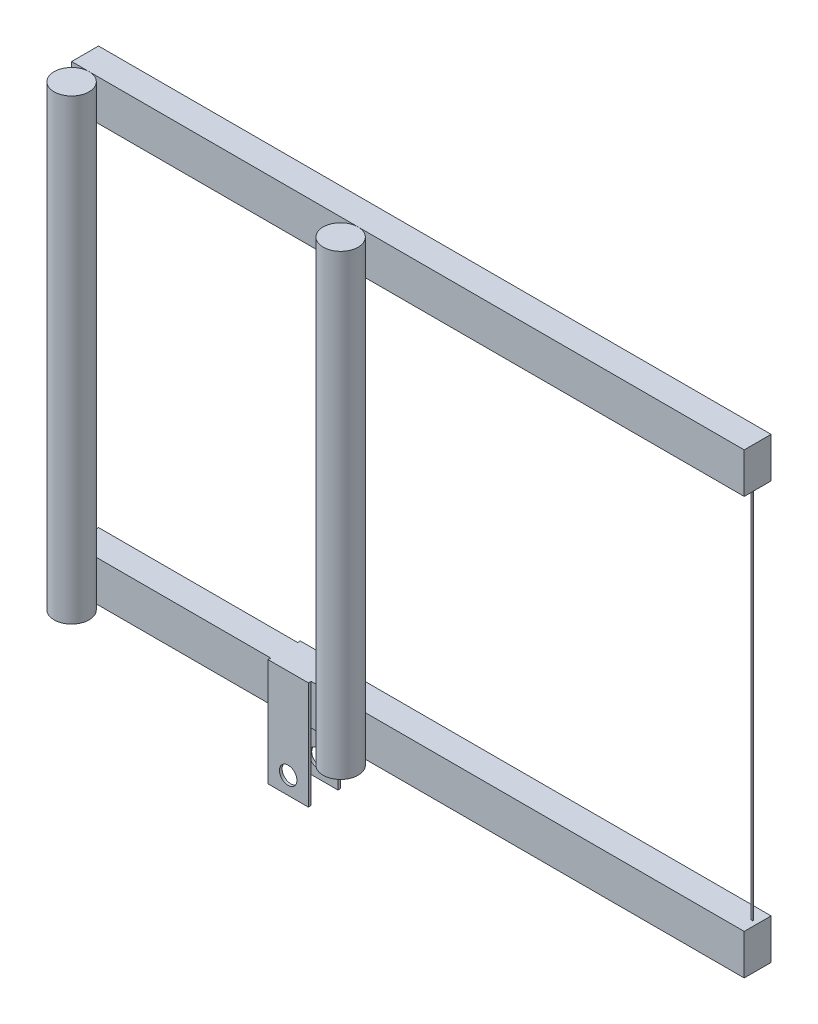
ISO-10303-21;
HEADER;
FILE_DESCRIPTION(('STEP AP214'),'2;1');
FILE_NAME('part.step','',(''),(''),'','','');
FILE_SCHEMA(('AUTOMOTIVE_DESIGN { 1 0 10303 214 1 1 1 1 }'));
ENDSEC;
DATA;
#1=APPLICATION_CONTEXT('core data for automotive mechanical design processes');
#2=APPLICATION_PROTOCOL_DEFINITION('international standard','automotive_design',2000,#1);
#3=PRODUCT_CONTEXT('',#1,'mechanical');
#4=PRODUCT('Part','Part','',(#3));
#5=PRODUCT_RELATED_PRODUCT_CATEGORY('part','',(#4));
#6=PRODUCT_DEFINITION_FORMATION('','',#4);
#7=PRODUCT_DEFINITION_CONTEXT('part definition',#1,'design');
#8=PRODUCT_DEFINITION('design','',#6,#7);
#9=PRODUCT_DEFINITION_SHAPE('','',#8);
#10=(LENGTH_UNIT() NAMED_UNIT(*) SI_UNIT(.MILLI.,.METRE.));
#11=(NAMED_UNIT(*) PLANE_ANGLE_UNIT() SI_UNIT($,.RADIAN.));
#12=(NAMED_UNIT(*) SI_UNIT($,.STERADIAN.) SOLID_ANGLE_UNIT());
#13=UNCERTAINTY_MEASURE_WITH_UNIT(LENGTH_MEASURE(1.E-05),#10,'distance_accuracy_value','');
#14=(GEOMETRIC_REPRESENTATION_CONTEXT(3) GLOBAL_UNCERTAINTY_ASSIGNED_CONTEXT((#13)) GLOBAL_UNIT_ASSIGNED_CONTEXT((#10,
#11,#12)) REPRESENTATION_CONTEXT('',''));
#15=CARTESIAN_POINT('',(0.,0.,0.));
#16=DIRECTION('',(0.,0.,1.));
#17=DIRECTION('',(1.,0.,0.));
#18=AXIS2_PLACEMENT_3D('',#15,#16,#17);
#19=CARTESIAN_POINT('',(-37.,-206.7695526217,33.));
#20=DIRECTION('',(0.,1.,0.));
#21=DIRECTION('',(0.,0.,1.));
#22=AXIS2_PLACEMENT_3D('',#19,#20,#21);
#23=CYLINDRICAL_SURFACE('',#22,13.);
#24=CARTESIAN_POINT('',(-37.,-170.,33.));
#25=DIRECTION('',(0.,1.,0.));
#26=DIRECTION('',(0.,0.,1.));
#27=AXIS2_PLACEMENT_3D('',#24,#25,#26);
#28=CIRCLE('',#27,13.);
#29=CARTESIAN_POINT('',(-37.,-170.,46.));
#30=VERTEX_POINT('',#29);
#31=EDGE_CURVE('E11',#30,#30,#28,.F.);
#32=ORIENTED_EDGE('',*,*,#31,.F.);
#33=EDGE_LOOP('',(#32));
#34=FACE_BOUND('',#33,.T.);
#35=CARTESIAN_POINT('',(-37.,170.,33.));
#36=DIRECTION('',(0.,1.,0.));
#37=DIRECTION('',(0.,0.,1.));
#38=AXIS2_PLACEMENT_3D('',#35,#36,#37);
#39=CIRCLE('',#38,13.);
#40=CARTESIAN_POINT('',(-37.,170.,46.));
#41=VERTEX_POINT('',#40);
#42=EDGE_CURVE('E45',#41,#41,#39,.T.);
#43=ORIENTED_EDGE('',*,*,#42,.F.);
#44=EDGE_LOOP('',(#43));
#45=FACE_BOUND('',#44,.T.);
#46=ADVANCED_FACE('F39',(#34,#45),#23,.T.);
#47=CARTESIAN_POINT('',(-37.,170.,33.));
#48=DIRECTION('',(0.,1.,0.));
#49=DIRECTION('',(0.,0.,1.));
#50=AXIS2_PLACEMENT_3D('',#47,#48,#49);
#51=PLANE('',#50);
#52=ORIENTED_EDGE('',*,*,#42,.T.);
#53=EDGE_LOOP('',(#52));
#54=FACE_BOUND('',#53,.T.);
#55=ADVANCED_FACE('F51',(#54),#51,.T.);
#56=CARTESIAN_POINT('',(-250.,-170.,20.));
#57=DIRECTION('',(0.,1.,0.));
#58=DIRECTION('',(0.,0.,1.));
#59=AXIS2_PLACEMENT_3D('',#56,#57,#58);
#60=PLANE('',#59);
#61=ORIENTED_EDGE('',*,*,#31,.T.);
#62=EDGE_LOOP('',(#61));
#63=FACE_BOUND('',#62,.T.);
#64=ADVANCED_FACE('F58',(#63),#60,.F.);
#65=CLOSED_SHELL('',(#46,#55,#64));
#66=MANIFOLD_SOLID_BREP('B2',#65);
#67=CARTESIAN_POINT('',(-237.,-206.7695526217,33.));
#68=DIRECTION('',(0.,1.,0.));
#69=DIRECTION('',(0.,0.,1.));
#70=AXIS2_PLACEMENT_3D('',#67,#68,#69);
#71=CYLINDRICAL_SURFACE('',#70,13.);
#72=CARTESIAN_POINT('',(-237.,-170.,33.));
#73=DIRECTION('',(0.,1.,0.));
#74=DIRECTION('',(0.,0.,1.));
#75=AXIS2_PLACEMENT_3D('',#72,#73,#74);
#76=CIRCLE('',#75,13.);
#77=CARTESIAN_POINT('',(-237.,-170.,46.));
#78=VERTEX_POINT('',#77);
#79=EDGE_CURVE('E38',#78,#78,#76,.F.);
#80=ORIENTED_EDGE('',*,*,#79,.F.);
#81=EDGE_LOOP('',(#80));
#82=FACE_BOUND('',#81,.T.);
#83=CARTESIAN_POINT('',(-237.,170.,33.));
#84=DIRECTION('',(0.,1.,0.));
#85=DIRECTION('',(0.,0.,1.));
#86=AXIS2_PLACEMENT_3D('',#83,#84,#85);
#87=CIRCLE('',#86,13.);
#88=CARTESIAN_POINT('',(-237.,170.,46.));
#89=VERTEX_POINT('',#88);
#90=EDGE_CURVE('E94',#89,#89,#87,.T.);
#91=ORIENTED_EDGE('',*,*,#90,.F.);
#92=EDGE_LOOP('',(#91));
#93=FACE_BOUND('',#92,.T.);
#94=ADVANCED_FACE('F88',(#82,#93),#71,.T.);
#95=CARTESIAN_POINT('',(-237.,170.,33.));
#96=DIRECTION('',(0.,1.,0.));
#97=DIRECTION('',(0.,0.,1.));
#98=AXIS2_PLACEMENT_3D('',#95,#96,#97);
#99=PLANE('',#98);
#100=ORIENTED_EDGE('',*,*,#90,.T.);
#101=EDGE_LOOP('',(#100));
#102=FACE_BOUND('',#101,.T.);
#103=ADVANCED_FACE('F100',(#102),#99,.T.);
#104=CARTESIAN_POINT('',(-250.,-170.,20.));
#105=DIRECTION('',(0.,1.,0.));
#106=DIRECTION('',(0.,0.,1.));
#107=AXIS2_PLACEMENT_3D('',#104,#105,#106);
#108=PLANE('',#107);
#109=ORIENTED_EDGE('',*,*,#79,.T.);
#110=EDGE_LOOP('',(#109));
#111=FACE_BOUND('',#110,.T.);
#112=ADVANCED_FACE('F107',(#111),#108,.F.);
#113=CLOSED_SHELL('',(#94,#103,#112));
#114=MANIFOLD_SOLID_BREP('B6',#113);
#115=CARTESIAN_POINT('',(0.,0.,20.));
#116=DIRECTION('',(0.,0.,-1.));
#117=DIRECTION('',(-1.,0.,0.));
#118=AXIS2_PLACEMENT_3D('',#115,#116,#117);
#119=PLANE('',#118);
#120=DIRECTION('',(0.,1.,0.));
#121=VECTOR('',#120,1.);
#122=CARTESIAN_POINT('',(-72.,-220.,20.));
#123=LINE('',#122,#121);
#124=CARTESIAN_POINT('',(-72.,-170.,20.));
#125=VERTEX_POINT('',#124);
#126=CARTESIAN_POINT('',(-72.,-140.,20.));
#127=VERTEX_POINT('',#126);
#128=EDGE_CURVE('E86',#125,#127,#123,.T.);
#129=ORIENTED_EDGE('',*,*,#128,.F.);
#130=DIRECTION('',(1.,0.,0.));
#131=VECTOR('',#130,1.);
#132=CARTESIAN_POINT('',(-250.,-170.,20.));
#133=LINE('',#132,#131);
#134=CARTESIAN_POINT('',(250.,-170.,20.));
#135=VERTEX_POINT('',#134);
#136=EDGE_CURVE('E393',#125,#135,#133,.T.);
#137=ORIENTED_EDGE('',*,*,#136,.T.);
#138=DIRECTION('',(0.,1.,0.));
#139=VECTOR('',#138,1.);
#140=CARTESIAN_POINT('',(250.,-170.,20.));
#141=LINE('',#140,#139);
#142=CARTESIAN_POINT('',(250.,-140.,20.));
#143=VERTEX_POINT('',#142);
#144=EDGE_CURVE('E390',#135,#143,#141,.T.);
#145=ORIENTED_EDGE('',*,*,#144,.T.);
#146=DIRECTION('',(-1.,0.,0.));
#147=VECTOR('',#146,1.);
#148=CARTESIAN_POINT('',(220.,-140.,20.));
#149=LINE('',#148,#147);
#150=EDGE_CURVE('E444',#143,#127,#149,.T.);
#151=ORIENTED_EDGE('',*,*,#150,.T.);
#152=EDGE_LOOP('',(#129,#137,#145,#151));
#153=FACE_BOUND('',#152,.T.);
#154=ADVANCED_FACE('F128',(#153),#119,.F.);
#155=CARTESIAN_POINT('',(0.,0.,0.));
#156=DIRECTION('',(0.,0.,-1.));
#157=DIRECTION('',(-1.,0.,0.));
#158=AXIS2_PLACEMENT_3D('',#155,#156,#157);
#159=PLANE('',#158);
#160=DIRECTION('',(1.,0.,0.));
#161=VECTOR('',#160,1.);
#162=CARTESIAN_POINT('',(-250.,-170.,0.));
#163=LINE('',#162,#161);
#164=CARTESIAN_POINT('',(-72.,-170.,0.));
#165=VERTEX_POINT('',#164);
#166=CARTESIAN_POINT('',(250.,-170.,0.));
#167=VERTEX_POINT('',#166);
#168=EDGE_CURVE('E451',#165,#167,#163,.T.);
#169=ORIENTED_EDGE('',*,*,#168,.F.);
#170=DIRECTION('',(0.,1.,0.));
#171=VECTOR('',#170,1.);
#172=CARTESIAN_POINT('',(-72.,-220.,0.));
#173=LINE('',#172,#171);
#174=CARTESIAN_POINT('',(-72.,-140.,0.));
#175=VERTEX_POINT('',#174);
#176=EDGE_CURVE('E421',#165,#175,#173,.T.);
#177=ORIENTED_EDGE('',*,*,#176,.T.);
#178=DIRECTION('',(-1.,0.,0.));
#179=VECTOR('',#178,1.);
#180=CARTESIAN_POINT('',(-220.,-140.,0.));
#181=LINE('',#180,#179);
#182=CARTESIAN_POINT('',(250.,-140.,0.));
#183=VERTEX_POINT('',#182);
#184=EDGE_CURVE('E398',#183,#175,#181,.T.);
#185=ORIENTED_EDGE('',*,*,#184,.F.);
#186=DIRECTION('',(0.,1.,0.));
#187=VECTOR('',#186,1.);
#188=CARTESIAN_POINT('',(250.,-170.,0.));
#189=LINE('',#188,#187);
#190=EDGE_CURVE('E455',#167,#183,#189,.T.);
#191=ORIENTED_EDGE('',*,*,#190,.F.);
#192=EDGE_LOOP('',(#169,#177,#185,#191));
#193=FACE_BOUND('',#192,.T.);
#194=ADVANCED_FACE('F357',(#193),#159,.T.);
#195=CARTESIAN_POINT('',(-250.,-170.,20.));
#196=DIRECTION('',(0.,1.,0.));
#197=DIRECTION('',(0.,0.,1.));
#198=AXIS2_PLACEMENT_3D('',#195,#196,#197);
#199=PLANE('',#198);
#200=CARTESIAN_POINT('',(-250.,-170.,0.));
#201=VERTEX_POINT('',#200);
#202=CARTESIAN_POINT('',(-102.,-170.,0.));
#203=VERTEX_POINT('',#202);
#204=EDGE_CURVE('E452',#201,#203,#163,.T.);
#205=ORIENTED_EDGE('',*,*,#204,.T.);
#206=EDGE_CURVE('E456',#203,#165,#163,.T.);
#207=ORIENTED_EDGE('',*,*,#206,.T.);
#208=ORIENTED_EDGE('',*,*,#168,.T.);
#209=DIRECTION('',(0.,0.,-1.));
#210=VECTOR('',#209,1.);
#211=CARTESIAN_POINT('',(250.,-170.,20.));
#212=LINE('',#211,#210);
#213=EDGE_CURVE('E465',#135,#167,#212,.T.);
#214=ORIENTED_EDGE('',*,*,#213,.F.);
#215=ORIENTED_EDGE('',*,*,#136,.F.);
#216=CARTESIAN_POINT('',(-102.,-170.,20.));
#217=VERTEX_POINT('',#216);
#218=EDGE_CURVE('E391',#217,#125,#133,.T.);
#219=ORIENTED_EDGE('',*,*,#218,.F.);
#220=CARTESIAN_POINT('',(-250.,-170.,20.));
#221=VERTEX_POINT('',#220);
#222=EDGE_CURVE('E383',#221,#217,#133,.T.);
#223=ORIENTED_EDGE('',*,*,#222,.F.);
#224=DIRECTION('',(0.,0.,-1.));
#225=VECTOR('',#224,1.);
#226=CARTESIAN_POINT('',(-250.,-170.,20.));
#227=LINE('',#226,#225);
#228=EDGE_CURVE('E464',#221,#201,#227,.T.);
#229=ORIENTED_EDGE('',*,*,#228,.T.);
#230=EDGE_LOOP('',(#205,#207,#208,#214,#215,#219,#223,#229));
#231=FACE_BOUND('',#230,.T.);
#232=ADVANCED_FACE('F364',(#231),#199,.F.);
#233=CARTESIAN_POINT('',(250.,-170.,20.));
#234=DIRECTION('',(-1.,0.,0.));
#235=DIRECTION('',(0.,0.,1.));
#236=AXIS2_PLACEMENT_3D('',#233,#234,#235);
#237=PLANE('',#236);
#238=ORIENTED_EDGE('',*,*,#190,.T.);
#239=DIRECTION('',(0.,0.,-1.));
#240=VECTOR('',#239,1.);
#241=CARTESIAN_POINT('',(250.,-140.,20.));
#242=LINE('',#241,#240);
#243=EDGE_CURVE('E446',#143,#183,#242,.T.);
#244=ORIENTED_EDGE('',*,*,#243,.F.);
#245=ORIENTED_EDGE('',*,*,#144,.F.);
#246=ORIENTED_EDGE('',*,*,#213,.T.);
#247=EDGE_LOOP('',(#238,#244,#245,#246));
#248=FACE_BOUND('',#247,.T.);
#249=ADVANCED_FACE('F371',(#248),#237,.F.);
#250=ORIENTED_EDGE('',*,*,#222,.T.);
#251=DIRECTION('',(0.,1.,0.));
#252=VECTOR('',#251,1.);
#253=CARTESIAN_POINT('',(-102.,-220.,20.));
#254=LINE('',#253,#252);
#255=CARTESIAN_POINT('',(-102.,-140.,20.));
#256=VERTEX_POINT('',#255);
#257=EDGE_CURVE('E137',#217,#256,#254,.T.);
#258=ORIENTED_EDGE('',*,*,#257,.T.);
#259=CARTESIAN_POINT('',(-250.,-140.,20.));
#260=VERTEX_POINT('',#259);
#261=EDGE_CURVE('E319',#256,#260,#149,.T.);
#262=ORIENTED_EDGE('',*,*,#261,.T.);
#263=DIRECTION('',(0.,-1.,0.));
#264=VECTOR('',#263,1.);
#265=CARTESIAN_POINT('',(-250.,-170.,20.));
#266=LINE('',#265,#264);
#267=EDGE_CURVE('E385',#260,#221,#266,.T.);
#268=ORIENTED_EDGE('',*,*,#267,.T.);
#269=EDGE_LOOP('',(#250,#258,#262,#268));
#270=FACE_BOUND('',#269,.T.);
#271=ADVANCED_FACE('F360',(#270),#119,.F.);
#272=DIRECTION('',(0.,1.,0.));
#273=VECTOR('',#272,1.);
#274=CARTESIAN_POINT('',(-102.,-220.,0.));
#275=LINE('',#274,#273);
#276=CARTESIAN_POINT('',(-102.,-140.,0.));
#277=VERTEX_POINT('',#276);
#278=EDGE_CURVE('E417',#203,#277,#275,.T.);
#279=ORIENTED_EDGE('',*,*,#278,.F.);
#280=ORIENTED_EDGE('',*,*,#204,.F.);
#281=DIRECTION('',(0.,-1.,0.));
#282=VECTOR('',#281,1.);
#283=CARTESIAN_POINT('',(-250.,-170.,0.));
#284=LINE('',#283,#282);
#285=CARTESIAN_POINT('',(-250.,-140.,0.));
#286=VERTEX_POINT('',#285);
#287=EDGE_CURVE('E406',#286,#201,#284,.T.);
#288=ORIENTED_EDGE('',*,*,#287,.F.);
#289=EDGE_CURVE('E400',#277,#286,#181,.T.);
#290=ORIENTED_EDGE('',*,*,#289,.F.);
#291=EDGE_LOOP('',(#279,#280,#288,#290));
#292=FACE_BOUND('',#291,.T.);
#293=ADVANCED_FACE('F367',(#292),#159,.T.);
#294=CARTESIAN_POINT('',(-220.,-140.,20.));
#295=DIRECTION('',(0.,-1.,0.));
#296=DIRECTION('',(0.,0.,-1.));
#297=AXIS2_PLACEMENT_3D('',#294,#295,#296);
#298=PLANE('',#297);
#299=DIRECTION('',(1.,0.,0.));
#300=VECTOR('',#299,1.);
#301=CARTESIAN_POINT('',(-220.,-140.,9.49999999999946));
#302=LINE('',#301,#300);
#303=CARTESIAN_POINT('',(245.,-140.,9.5));
#304=VERTEX_POINT('',#303);
#305=CARTESIAN_POINT('',(246.5,-140.,9.5));
#306=VERTEX_POINT('',#305);
#307=EDGE_CURVE('E420',#304,#306,#302,.T.);
#308=ORIENTED_EDGE('',*,*,#307,.T.);
#309=DIRECTION('',(0.,0.,1.));
#310=VECTOR('',#309,1.);
#311=CARTESIAN_POINT('',(246.5,-140.,20.));
#312=LINE('',#311,#310);
#313=CARTESIAN_POINT('',(246.5,-140.,10.));
#314=VERTEX_POINT('',#313);
#315=EDGE_CURVE('E318',#306,#314,#312,.T.);
#316=ORIENTED_EDGE('',*,*,#315,.T.);
#317=DIRECTION('',(-1.,0.,0.));
#318=VECTOR('',#317,1.);
#319=CARTESIAN_POINT('',(-220.,-140.,10.));
#320=LINE('',#319,#318);
#321=CARTESIAN_POINT('',(245.,-140.,10.));
#322=VERTEX_POINT('',#321);
#323=EDGE_CURVE('E440',#314,#322,#320,.T.);
#324=ORIENTED_EDGE('',*,*,#323,.T.);
#325=DIRECTION('',(0.,0.,-1.));
#326=VECTOR('',#325,1.);
#327=CARTESIAN_POINT('',(245.,-140.,20.));
#328=LINE('',#327,#326);
#329=EDGE_CURVE('E437',#322,#304,#328,.T.);
#330=ORIENTED_EDGE('',*,*,#329,.T.);
#331=EDGE_LOOP('',(#308,#316,#324,#330));
#332=FACE_BOUND('',#331,.T.);
#333=ORIENTED_EDGE('',*,*,#184,.T.);
#334=DIRECTION('',(0.,0.,-1.));
#335=VECTOR('',#334,1.);
#336=CARTESIAN_POINT('',(-72.,-140.,0.));
#337=LINE('',#336,#335);
#338=CARTESIAN_POINT('',(-72.,-140.,-2.));
#339=VERTEX_POINT('',#338);
#340=EDGE_CURVE('E423',#175,#339,#337,.T.);
#341=ORIENTED_EDGE('',*,*,#340,.T.);
#342=DIRECTION('',(-1.,0.,0.));
#343=VECTOR('',#342,1.);
#344=CARTESIAN_POINT('',(-102.,-140.,-2.));
#345=LINE('',#344,#343);
#346=CARTESIAN_POINT('',(-102.,-140.,-2.));
#347=VERTEX_POINT('',#346);
#348=EDGE_CURVE('E426',#339,#347,#345,.T.);
#349=ORIENTED_EDGE('',*,*,#348,.T.);
#350=DIRECTION('',(0.,0.,1.));
#351=VECTOR('',#350,1.);
#352=CARTESIAN_POINT('',(-102.,-140.,0.));
#353=LINE('',#352,#351);
#354=EDGE_CURVE('E427',#347,#277,#353,.T.);
#355=ORIENTED_EDGE('',*,*,#354,.T.);
#356=ORIENTED_EDGE('',*,*,#289,.T.);
#357=DIRECTION('',(0.,0.,1.));
#358=VECTOR('',#357,1.);
#359=CARTESIAN_POINT('',(-250.,-140.,-281.602556806574));
#360=LINE('',#359,#358);
#361=EDGE_CURVE('E403',#286,#260,#360,.T.);
#362=ORIENTED_EDGE('',*,*,#361,.T.);
#363=ORIENTED_EDGE('',*,*,#261,.F.);
#364=DIRECTION('',(0.,0.,1.));
#365=VECTOR('',#364,1.);
#366=CARTESIAN_POINT('',(-102.,-140.,20.));
#367=LINE('',#366,#365);
#368=CARTESIAN_POINT('',(-102.,-140.,22.));
#369=VERTEX_POINT('',#368);
#370=EDGE_CURVE('E145',#256,#369,#367,.T.);
#371=ORIENTED_EDGE('',*,*,#370,.T.);
#372=DIRECTION('',(1.,0.,0.));
#373=VECTOR('',#372,1.);
#374=CARTESIAN_POINT('',(-102.,-140.,22.));
#375=LINE('',#374,#373);
#376=CARTESIAN_POINT('',(-72.,-140.,22.));
#377=VERTEX_POINT('',#376);
#378=EDGE_CURVE('E283',#369,#377,#375,.T.);
#379=ORIENTED_EDGE('',*,*,#378,.T.);
#380=DIRECTION('',(0.,0.,-1.));
#381=VECTOR('',#380,1.);
#382=CARTESIAN_POINT('',(-72.,-140.,20.));
#383=LINE('',#382,#381);
#384=EDGE_CURVE('E301',#377,#127,#383,.T.);
#385=ORIENTED_EDGE('',*,*,#384,.T.);
#386=ORIENTED_EDGE('',*,*,#150,.F.);
#387=ORIENTED_EDGE('',*,*,#243,.T.);
#388=EDGE_LOOP('',(#333,#341,#349,#355,#356,#362,#363,#371,#379,#385,#386,#387));
#389=FACE_BOUND('',#388,.T.);
#390=ADVANCED_FACE('F377',(#332,#389),#298,.F.);
#391=CARTESIAN_POINT('',(-250.,-170.,20.));
#392=DIRECTION('',(1.,0.,0.));
#393=DIRECTION('',(0.,0.,-1.));
#394=AXIS2_PLACEMENT_3D('',#391,#392,#393);
#395=PLANE('',#394);
#396=ORIENTED_EDGE('',*,*,#267,.F.);
#397=ORIENTED_EDGE('',*,*,#361,.F.);
#398=ORIENTED_EDGE('',*,*,#287,.T.);
#399=ORIENTED_EDGE('',*,*,#228,.F.);
#400=EDGE_LOOP('',(#396,#397,#398,#399));
#401=FACE_BOUND('',#400,.T.);
#402=ADVANCED_FACE('F130',(#401),#395,.F.);
#403=CARTESIAN_POINT('',(-102.,-220.,0.));
#404=DIRECTION('',(0.,0.,1.));
#405=DIRECTION('',(1.,0.,0.));
#406=AXIS2_PLACEMENT_3D('',#403,#404,#405);
#407=PLANE('',#406);
#408=CARTESIAN_POINT('',(-87.,-207.,0.));
#409=DIRECTION('',(0.,0.,1.));
#410=DIRECTION('',(1.,0.,0.));
#411=AXIS2_PLACEMENT_3D('',#408,#409,#410);
#412=CIRCLE('',#411,6.5);
#413=CARTESIAN_POINT('',(-80.4999999999999,-207.,0.));
#414=VERTEX_POINT('',#413);
#415=EDGE_CURVE('E305',#414,#414,#412,.T.);
#416=ORIENTED_EDGE('',*,*,#415,.F.);
#417=EDGE_LOOP('',(#416));
#418=FACE_BOUND('',#417,.T.);
#419=ORIENTED_EDGE('',*,*,#206,.F.);
#420=CARTESIAN_POINT('',(-102.,-220.,0.));
#421=VERTEX_POINT('',#420);
#422=EDGE_CURVE('E408',#421,#203,#275,.T.);
#423=ORIENTED_EDGE('',*,*,#422,.F.);
#424=DIRECTION('',(1.,0.,0.));
#425=VECTOR('',#424,1.);
#426=CARTESIAN_POINT('',(-102.,-220.,0.));
#427=LINE('',#426,#425);
#428=CARTESIAN_POINT('',(-72.,-220.,0.));
#429=VERTEX_POINT('',#428);
#430=EDGE_CURVE('E484',#421,#429,#427,.T.);
#431=ORIENTED_EDGE('',*,*,#430,.T.);
#432=EDGE_CURVE('E412',#429,#165,#173,.T.);
#433=ORIENTED_EDGE('',*,*,#432,.T.);
#434=EDGE_LOOP('',(#419,#423,#431,#433));
#435=FACE_BOUND('',#434,.T.);
#436=ADVANCED_FACE('F482',(#418,#435),#407,.T.);
#437=CARTESIAN_POINT('',(-102.,-220.,0.));
#438=DIRECTION('',(-1.,0.,0.));
#439=DIRECTION('',(0.,0.,1.));
#440=AXIS2_PLACEMENT_3D('',#437,#438,#439);
#441=PLANE('',#440);
#442=ORIENTED_EDGE('',*,*,#354,.F.);
#443=DIRECTION('',(0.,1.,0.));
#444=VECTOR('',#443,1.);
#445=CARTESIAN_POINT('',(-102.,-220.,-2.));
#446=LINE('',#445,#444);
#447=CARTESIAN_POINT('',(-102.,-220.,-2.));
#448=VERTEX_POINT('',#447);
#449=EDGE_CURVE('E407',#448,#347,#446,.T.);
#450=ORIENTED_EDGE('',*,*,#449,.F.);
#451=DIRECTION('',(0.,0.,1.));
#452=VECTOR('',#451,1.);
#453=CARTESIAN_POINT('',(-102.,-220.,0.));
#454=LINE('',#453,#452);
#455=EDGE_CURVE('E490',#448,#421,#454,.T.);
#456=ORIENTED_EDGE('',*,*,#455,.T.);
#457=ORIENTED_EDGE('',*,*,#422,.T.);
#458=ORIENTED_EDGE('',*,*,#278,.T.);
#459=EDGE_LOOP('',(#442,#450,#456,#457,#458));
#460=FACE_BOUND('',#459,.T.);
#461=ADVANCED_FACE('F557',(#460),#441,.T.);
#462=CARTESIAN_POINT('',(-102.,-220.,-2.));
#463=DIRECTION('',(0.,0.,-1.));
#464=DIRECTION('',(-1.,0.,0.));
#465=AXIS2_PLACEMENT_3D('',#462,#463,#464);
#466=PLANE('',#465);
#467=CARTESIAN_POINT('',(-87.,-207.,-2.));
#468=DIRECTION('',(0.,0.,-1.));
#469=DIRECTION('',(-1.,0.,0.));
#470=AXIS2_PLACEMENT_3D('',#467,#468,#469);
#471=CIRCLE('',#470,6.5);
#472=CARTESIAN_POINT('',(-93.5,-207.,-2.));
#473=VERTEX_POINT('',#472);
#474=EDGE_CURVE('E332',#473,#473,#471,.F.);
#475=ORIENTED_EDGE('',*,*,#474,.T.);
#476=EDGE_LOOP('',(#475));
#477=FACE_BOUND('',#476,.T.);
#478=ORIENTED_EDGE('',*,*,#348,.F.);
#479=DIRECTION('',(0.,1.,0.));
#480=VECTOR('',#479,1.);
#481=CARTESIAN_POINT('',(-72.,-220.,-2.));
#482=LINE('',#481,#480);
#483=CARTESIAN_POINT('',(-72.,-220.,-2.));
#484=VERTEX_POINT('',#483);
#485=EDGE_CURVE('E485',#484,#339,#482,.T.);
#486=ORIENTED_EDGE('',*,*,#485,.F.);
#487=DIRECTION('',(-1.,0.,0.));
#488=VECTOR('',#487,1.);
#489=CARTESIAN_POINT('',(-102.,-220.,-2.));
#490=LINE('',#489,#488);
#491=EDGE_CURVE('E413',#484,#448,#490,.T.);
#492=ORIENTED_EDGE('',*,*,#491,.T.);
#493=ORIENTED_EDGE('',*,*,#449,.T.);
#494=EDGE_LOOP('',(#478,#486,#492,#493));
#495=FACE_BOUND('',#494,.T.);
#496=ADVANCED_FACE('F561',(#477,#495),#466,.T.);
#497=CARTESIAN_POINT('',(-72.,-220.,0.));
#498=DIRECTION('',(1.,0.,0.));
#499=DIRECTION('',(0.,0.,-1.));
#500=AXIS2_PLACEMENT_3D('',#497,#498,#499);
#501=PLANE('',#500);
#502=ORIENTED_EDGE('',*,*,#340,.F.);
#503=ORIENTED_EDGE('',*,*,#176,.F.);
#504=ORIENTED_EDGE('',*,*,#432,.F.);
#505=DIRECTION('',(0.,0.,-1.));
#506=VECTOR('',#505,1.);
#507=CARTESIAN_POINT('',(-72.,-220.,0.));
#508=LINE('',#507,#506);
#509=EDGE_CURVE('E493',#429,#484,#508,.T.);
#510=ORIENTED_EDGE('',*,*,#509,.T.);
#511=ORIENTED_EDGE('',*,*,#485,.T.);
#512=EDGE_LOOP('',(#502,#503,#504,#510,#511));
#513=FACE_BOUND('',#512,.T.);
#514=ADVANCED_FACE('F477',(#513),#501,.T.);
#515=CARTESIAN_POINT('',(0.,-220.,0.));
#516=DIRECTION('',(0.,-1.,0.));
#517=DIRECTION('',(0.,0.,-1.));
#518=AXIS2_PLACEMENT_3D('',#515,#516,#517);
#519=PLANE('',#518);
#520=ORIENTED_EDGE('',*,*,#455,.F.);
#521=ORIENTED_EDGE('',*,*,#491,.F.);
#522=ORIENTED_EDGE('',*,*,#509,.F.);
#523=ORIENTED_EDGE('',*,*,#430,.F.);
#524=EDGE_LOOP('',(#520,#521,#522,#523));
#525=FACE_BOUND('',#524,.T.);
#526=ADVANCED_FACE('F565',(#525),#519,.T.);
#527=CARTESIAN_POINT('',(246.5,-171.581138830084,9.5));
#528=DIRECTION('',(1.,0.,0.));
#529=DIRECTION('',(0.,0.,-1.));
#530=AXIS2_PLACEMENT_3D('',#527,#528,#529);
#531=PLANE('',#530);
#532=ORIENTED_EDGE('',*,*,#315,.F.);
#533=DIRECTION('',(0.,1.,0.));
#534=VECTOR('',#533,1.);
#535=CARTESIAN_POINT('',(246.5,-171.581138830084,9.5));
#536=LINE('',#535,#534);
#537=CARTESIAN_POINT('',(246.5,140.,9.5));
#538=VERTEX_POINT('',#537);
#539=EDGE_CURVE('E153',#306,#538,#536,.T.);
#540=ORIENTED_EDGE('',*,*,#539,.T.);
#541=DIRECTION('',(0.,0.,-1.));
#542=VECTOR('',#541,1.);
#543=CARTESIAN_POINT('',(246.5,140.,20.));
#544=LINE('',#543,#542);
#545=CARTESIAN_POINT('',(246.5,140.,10.));
#546=VERTEX_POINT('',#545);
#547=EDGE_CURVE('E432',#546,#538,#544,.T.);
#548=ORIENTED_EDGE('',*,*,#547,.F.);
#549=DIRECTION('',(0.,1.,0.));
#550=VECTOR('',#549,1.);
#551=CARTESIAN_POINT('',(246.5,-171.581138830084,10.));
#552=LINE('',#551,#550);
#553=EDGE_CURVE('E514',#314,#546,#552,.T.);
#554=ORIENTED_EDGE('',*,*,#553,.F.);
#555=EDGE_LOOP('',(#532,#540,#548,#554));
#556=FACE_BOUND('',#555,.T.);
#557=ADVANCED_FACE('F567',(#556),#531,.T.);
#558=CARTESIAN_POINT('',(245.,-171.581138830084,10.));
#559=DIRECTION('',(0.,0.,1.));
#560=DIRECTION('',(1.,0.,0.));
#561=AXIS2_PLACEMENT_3D('',#558,#559,#560);
#562=PLANE('',#561);
#563=ORIENTED_EDGE('',*,*,#323,.F.);
#564=ORIENTED_EDGE('',*,*,#553,.T.);
#565=DIRECTION('',(1.,0.,0.));
#566=VECTOR('',#565,1.);
#567=CARTESIAN_POINT('',(220.,140.,10.));
#568=LINE('',#567,#566);
#569=CARTESIAN_POINT('',(245.,140.,10.));
#570=VERTEX_POINT('',#569);
#571=EDGE_CURVE('E500',#570,#546,#568,.T.);
#572=ORIENTED_EDGE('',*,*,#571,.F.);
#573=DIRECTION('',(0.,1.,0.));
#574=VECTOR('',#573,1.);
#575=CARTESIAN_POINT('',(245.,-171.581138830084,10.));
#576=LINE('',#575,#574);
#577=EDGE_CURVE('E546',#322,#570,#576,.T.);
#578=ORIENTED_EDGE('',*,*,#577,.F.);
#579=EDGE_LOOP('',(#563,#564,#572,#578));
#580=FACE_BOUND('',#579,.T.);
#581=ADVANCED_FACE('F573',(#580),#562,.T.);
#582=CARTESIAN_POINT('',(245.,-171.581138830084,9.5));
#583=DIRECTION('',(-1.,0.,0.));
#584=DIRECTION('',(0.,0.,1.));
#585=AXIS2_PLACEMENT_3D('',#582,#583,#584);
#586=PLANE('',#585);
#587=ORIENTED_EDGE('',*,*,#329,.F.);
#588=ORIENTED_EDGE('',*,*,#577,.T.);
#589=DIRECTION('',(0.,0.,1.));
#590=VECTOR('',#589,1.);
#591=CARTESIAN_POINT('',(245.,140.,20.));
#592=LINE('',#591,#590);
#593=CARTESIAN_POINT('',(245.,140.,9.5));
#594=VERTEX_POINT('',#593);
#595=EDGE_CURVE('E503',#594,#570,#592,.T.);
#596=ORIENTED_EDGE('',*,*,#595,.F.);
#597=DIRECTION('',(0.,1.,0.));
#598=VECTOR('',#597,1.);
#599=CARTESIAN_POINT('',(245.,-171.581138830084,9.5));
#600=LINE('',#599,#598);
#601=EDGE_CURVE('E544',#304,#594,#600,.T.);
#602=ORIENTED_EDGE('',*,*,#601,.F.);
#603=EDGE_LOOP('',(#587,#588,#596,#602));
#604=FACE_BOUND('',#603,.T.);
#605=ADVANCED_FACE('F623',(#604),#586,.T.);
#606=CARTESIAN_POINT('',(245.,-171.581138830084,9.5));
#607=DIRECTION('',(0.,0.,-1.));
#608=DIRECTION('',(-1.,0.,0.));
#609=AXIS2_PLACEMENT_3D('',#606,#607,#608);
#610=PLANE('',#609);
#611=ORIENTED_EDGE('',*,*,#307,.F.);
#612=ORIENTED_EDGE('',*,*,#601,.T.);
#613=DIRECTION('',(-1.,0.,0.));
#614=VECTOR('',#613,1.);
#615=CARTESIAN_POINT('',(220.,140.,9.49999999999997));
#616=LINE('',#615,#614);
#617=EDGE_CURVE('E506',#538,#594,#616,.T.);
#618=ORIENTED_EDGE('',*,*,#617,.F.);
#619=ORIENTED_EDGE('',*,*,#539,.F.);
#620=EDGE_LOOP('',(#611,#612,#618,#619));
#621=FACE_BOUND('',#620,.T.);
#622=ADVANCED_FACE('F633',(#621),#610,.T.);
#623=CARTESIAN_POINT('',(-250.,-170.,20.));
#624=DIRECTION('',(1.,0.,0.));
#625=DIRECTION('',(0.,0.,-1.));
#626=AXIS2_PLACEMENT_3D('',#623,#624,#625);
#627=PLANE('',#626);
#628=DIRECTION('',(0.,-1.,0.));
#629=VECTOR('',#628,1.);
#630=CARTESIAN_POINT('',(-250.,-170.,0.));
#631=LINE('',#630,#629);
#632=CARTESIAN_POINT('',(-250.,170.,0.));
#633=VERTEX_POINT('',#632);
#634=CARTESIAN_POINT('',(-250.,140.,0.));
#635=VERTEX_POINT('',#634);
#636=EDGE_CURVE('E510',#633,#635,#631,.T.);
#637=ORIENTED_EDGE('',*,*,#636,.T.);
#638=DIRECTION('',(0.,0.,1.));
#639=VECTOR('',#638,1.);
#640=CARTESIAN_POINT('',(-250.,140.,-281.602556806574));
#641=LINE('',#640,#639);
#642=CARTESIAN_POINT('',(-250.,140.,20.));
#643=VERTEX_POINT('',#642);
#644=EDGE_CURVE('E513',#635,#643,#641,.T.);
#645=ORIENTED_EDGE('',*,*,#644,.T.);
#646=DIRECTION('',(0.,-1.,0.));
#647=VECTOR('',#646,1.);
#648=CARTESIAN_POINT('',(-250.,-170.,20.));
#649=LINE('',#648,#647);
#650=CARTESIAN_POINT('',(-250.,170.,20.));
#651=VERTEX_POINT('',#650);
#652=EDGE_CURVE('E515',#651,#643,#649,.T.);
#653=ORIENTED_EDGE('',*,*,#652,.F.);
#654=DIRECTION('',(0.,0.,-1.));
#655=VECTOR('',#654,1.);
#656=CARTESIAN_POINT('',(-250.,170.,20.));
#657=LINE('',#656,#655);
#658=EDGE_CURVE('E519',#651,#633,#657,.T.);
#659=ORIENTED_EDGE('',*,*,#658,.T.);
#660=EDGE_LOOP('',(#637,#645,#653,#659));
#661=FACE_BOUND('',#660,.T.);
#662=ADVANCED_FACE('F579',(#661),#627,.F.);
#663=CARTESIAN_POINT('',(0.,0.,20.));
#664=DIRECTION('',(0.,0.,-1.));
#665=DIRECTION('',(-1.,0.,0.));
#666=AXIS2_PLACEMENT_3D('',#663,#664,#665);
#667=PLANE('',#666);
#668=ORIENTED_EDGE('',*,*,#652,.T.);
#669=DIRECTION('',(1.,0.,0.));
#670=VECTOR('',#669,1.);
#671=CARTESIAN_POINT('',(-220.,140.,20.));
#672=LINE('',#671,#670);
#673=CARTESIAN_POINT('',(250.,140.,20.));
#674=VERTEX_POINT('',#673);
#675=EDGE_CURVE('E518',#643,#674,#672,.T.);
#676=ORIENTED_EDGE('',*,*,#675,.T.);
#677=DIRECTION('',(0.,1.,0.));
#678=VECTOR('',#677,1.);
#679=CARTESIAN_POINT('',(250.,140.,20.));
#680=LINE('',#679,#678);
#681=CARTESIAN_POINT('',(250.,170.,20.));
#682=VERTEX_POINT('',#681);
#683=EDGE_CURVE('E527',#674,#682,#680,.T.);
#684=ORIENTED_EDGE('',*,*,#683,.T.);
#685=DIRECTION('',(-1.,0.,0.));
#686=VECTOR('',#685,1.);
#687=CARTESIAN_POINT('',(-250.,170.,20.));
#688=LINE('',#687,#686);
#689=EDGE_CURVE('E524',#682,#651,#688,.T.);
#690=ORIENTED_EDGE('',*,*,#689,.T.);
#691=EDGE_LOOP('',(#668,#676,#684,#690));
#692=FACE_BOUND('',#691,.T.);
#693=ADVANCED_FACE('F651',(#692),#667,.F.);
#694=CARTESIAN_POINT('',(0.,0.,0.));
#695=DIRECTION('',(0.,0.,-1.));
#696=DIRECTION('',(-1.,0.,0.));
#697=AXIS2_PLACEMENT_3D('',#694,#695,#696);
#698=PLANE('',#697);
#699=DIRECTION('',(-1.,0.,0.));
#700=VECTOR('',#699,1.);
#701=CARTESIAN_POINT('',(-220.,140.,0.));
#702=LINE('',#701,#700);
#703=CARTESIAN_POINT('',(250.,140.,0.));
#704=VERTEX_POINT('',#703);
#705=EDGE_CURVE('E520',#704,#635,#702,.T.);
#706=ORIENTED_EDGE('',*,*,#705,.T.);
#707=ORIENTED_EDGE('',*,*,#636,.F.);
#708=DIRECTION('',(-1.,0.,0.));
#709=VECTOR('',#708,1.);
#710=CARTESIAN_POINT('',(-250.,170.,0.));
#711=LINE('',#710,#709);
#712=CARTESIAN_POINT('',(250.,170.,0.));
#713=VERTEX_POINT('',#712);
#714=EDGE_CURVE('E535',#713,#633,#711,.T.);
#715=ORIENTED_EDGE('',*,*,#714,.F.);
#716=DIRECTION('',(0.,1.,0.));
#717=VECTOR('',#716,1.);
#718=CARTESIAN_POINT('',(250.,140.,0.));
#719=LINE('',#718,#717);
#720=EDGE_CURVE('E523',#704,#713,#719,.T.);
#721=ORIENTED_EDGE('',*,*,#720,.F.);
#722=EDGE_LOOP('',(#706,#707,#715,#721));
#723=FACE_BOUND('',#722,.T.);
#724=ADVANCED_FACE('F660',(#723),#698,.T.);
#725=CARTESIAN_POINT('',(250.,140.,20.));
#726=DIRECTION('',(-1.,0.,0.));
#727=DIRECTION('',(0.,0.,1.));
#728=AXIS2_PLACEMENT_3D('',#725,#726,#727);
#729=PLANE('',#728);
#730=ORIENTED_EDGE('',*,*,#720,.T.);
#731=DIRECTION('',(0.,0.,-1.));
#732=VECTOR('',#731,1.);
#733=CARTESIAN_POINT('',(250.,170.,20.));
#734=LINE('',#733,#732);
#735=EDGE_CURVE('E509',#682,#713,#734,.T.);
#736=ORIENTED_EDGE('',*,*,#735,.F.);
#737=ORIENTED_EDGE('',*,*,#683,.F.);
#738=DIRECTION('',(0.,0.,-1.));
#739=VECTOR('',#738,1.);
#740=CARTESIAN_POINT('',(250.,140.,20.));
#741=LINE('',#740,#739);
#742=EDGE_CURVE('E534',#674,#704,#741,.T.);
#743=ORIENTED_EDGE('',*,*,#742,.T.);
#744=EDGE_LOOP('',(#730,#736,#737,#743));
#745=FACE_BOUND('',#744,.T.);
#746=ADVANCED_FACE('F670',(#745),#729,.F.);
#747=CARTESIAN_POINT('',(-250.,170.,20.));
#748=DIRECTION('',(0.,-1.,0.));
#749=DIRECTION('',(0.,0.,-1.));
#750=AXIS2_PLACEMENT_3D('',#747,#748,#749);
#751=PLANE('',#750);
#752=ORIENTED_EDGE('',*,*,#714,.T.);
#753=ORIENTED_EDGE('',*,*,#658,.F.);
#754=ORIENTED_EDGE('',*,*,#689,.F.);
#755=ORIENTED_EDGE('',*,*,#735,.T.);
#756=EDGE_LOOP('',(#752,#753,#754,#755));
#757=FACE_BOUND('',#756,.T.);
#758=ADVANCED_FACE('F679',(#757),#751,.F.);
#759=CARTESIAN_POINT('',(220.,140.,20.));
#760=DIRECTION('',(0.,1.,0.));
#761=DIRECTION('',(-1.,0.,0.));
#762=AXIS2_PLACEMENT_3D('',#759,#760,#761);
#763=PLANE('',#762);
#764=ORIENTED_EDGE('',*,*,#571,.T.);
#765=ORIENTED_EDGE('',*,*,#547,.T.);
#766=ORIENTED_EDGE('',*,*,#617,.T.);
#767=ORIENTED_EDGE('',*,*,#595,.T.);
#768=EDGE_LOOP('',(#764,#765,#766,#767));
#769=FACE_BOUND('',#768,.T.);
#770=ORIENTED_EDGE('',*,*,#705,.F.);
#771=ORIENTED_EDGE('',*,*,#742,.F.);
#772=ORIENTED_EDGE('',*,*,#675,.F.);
#773=ORIENTED_EDGE('',*,*,#644,.F.);
#774=EDGE_LOOP('',(#770,#771,#772,#773));
#775=FACE_BOUND('',#774,.T.);
#776=ADVANCED_FACE('F689',(#769,#775),#763,.F.);
#777=CARTESIAN_POINT('',(-102.,-220.,20.));
#778=DIRECTION('',(-1.,0.,0.));
#779=DIRECTION('',(0.,0.,1.));
#780=AXIS2_PLACEMENT_3D('',#777,#778,#779);
#781=PLANE('',#780);
#782=ORIENTED_EDGE('',*,*,#370,.F.);
#783=ORIENTED_EDGE('',*,*,#257,.F.);
#784=CARTESIAN_POINT('',(-102.,-220.,20.));
#785=VERTEX_POINT('',#784);
#786=EDGE_CURVE('E300',#785,#217,#254,.T.);
#787=ORIENTED_EDGE('',*,*,#786,.F.);
#788=DIRECTION('',(0.,0.,1.));
#789=VECTOR('',#788,1.);
#790=CARTESIAN_POINT('',(-102.,-220.,20.));
#791=LINE('',#790,#789);
#792=CARTESIAN_POINT('',(-102.,-220.,22.));
#793=VERTEX_POINT('',#792);
#794=EDGE_CURVE('E293',#785,#793,#791,.T.);
#795=ORIENTED_EDGE('',*,*,#794,.T.);
#796=DIRECTION('',(0.,1.,0.));
#797=VECTOR('',#796,1.);
#798=CARTESIAN_POINT('',(-102.,-220.,22.));
#799=LINE('',#798,#797);
#800=EDGE_CURVE('E278',#793,#369,#799,.T.);
#801=ORIENTED_EDGE('',*,*,#800,.T.);
#802=EDGE_LOOP('',(#782,#783,#787,#795,#801));
#803=FACE_BOUND('',#802,.T.);
#804=ADVANCED_FACE('F298',(#803),#781,.T.);
#805=CARTESIAN_POINT('',(-102.,-220.,20.));
#806=DIRECTION('',(0.,0.,-1.));
#807=DIRECTION('',(-1.,0.,0.));
#808=AXIS2_PLACEMENT_3D('',#805,#806,#807);
#809=PLANE('',#808);
#810=CARTESIAN_POINT('',(-87.,-207.,20.));
#811=DIRECTION('',(0.,0.,-1.));
#812=DIRECTION('',(-1.,0.,0.));
#813=AXIS2_PLACEMENT_3D('',#810,#811,#812);
#814=CIRCLE('',#813,6.5);
#815=CARTESIAN_POINT('',(-93.5,-207.,20.));
#816=VERTEX_POINT('',#815);
#817=EDGE_CURVE('E328',#816,#816,#814,.T.);
#818=ORIENTED_EDGE('',*,*,#817,.F.);
#819=EDGE_LOOP('',(#818));
#820=FACE_BOUND('',#819,.T.);
#821=ORIENTED_EDGE('',*,*,#786,.T.);
#822=ORIENTED_EDGE('',*,*,#218,.T.);
#823=CARTESIAN_POINT('',(-72.,-220.,20.));
#824=VERTEX_POINT('',#823);
#825=EDGE_CURVE('E313',#824,#125,#123,.T.);
#826=ORIENTED_EDGE('',*,*,#825,.F.);
#827=DIRECTION('',(-1.,0.,0.));
#828=VECTOR('',#827,1.);
#829=CARTESIAN_POINT('',(-102.,-220.,20.));
#830=LINE('',#829,#828);
#831=EDGE_CURVE('E286',#824,#785,#830,.T.);
#832=ORIENTED_EDGE('',*,*,#831,.T.);
#833=EDGE_LOOP('',(#821,#822,#826,#832));
#834=FACE_BOUND('',#833,.T.);
#835=ADVANCED_FACE('F352',(#820,#834),#809,.T.);
#836=CARTESIAN_POINT('',(-72.,-220.,20.));
#837=DIRECTION('',(1.,0.,0.));
#838=DIRECTION('',(0.,0.,-1.));
#839=AXIS2_PLACEMENT_3D('',#836,#837,#838);
#840=PLANE('',#839);
#841=ORIENTED_EDGE('',*,*,#384,.F.);
#842=DIRECTION('',(0.,1.,0.));
#843=VECTOR('',#842,1.);
#844=CARTESIAN_POINT('',(-72.,-220.,22.));
#845=LINE('',#844,#843);
#846=CARTESIAN_POINT('',(-72.,-220.,22.));
#847=VERTEX_POINT('',#846);
#848=EDGE_CURVE('E285',#847,#377,#845,.T.);
#849=ORIENTED_EDGE('',*,*,#848,.F.);
#850=DIRECTION('',(0.,0.,-1.));
#851=VECTOR('',#850,1.);
#852=CARTESIAN_POINT('',(-72.,-220.,20.));
#853=LINE('',#852,#851);
#854=EDGE_CURVE('E296',#847,#824,#853,.T.);
#855=ORIENTED_EDGE('',*,*,#854,.T.);
#856=ORIENTED_EDGE('',*,*,#825,.T.);
#857=ORIENTED_EDGE('',*,*,#128,.T.);
#858=EDGE_LOOP('',(#841,#849,#855,#856,#857));
#859=FACE_BOUND('',#858,.T.);
#860=ADVANCED_FACE('F345',(#859),#840,.T.);
#861=CARTESIAN_POINT('',(-102.,-220.,22.));
#862=DIRECTION('',(0.,0.,1.));
#863=DIRECTION('',(1.,0.,0.));
#864=AXIS2_PLACEMENT_3D('',#861,#862,#863);
#865=PLANE('',#864);
#866=CARTESIAN_POINT('',(-87.,-207.,22.));
#867=DIRECTION('',(0.,0.,1.));
#868=DIRECTION('',(1.,0.,0.));
#869=AXIS2_PLACEMENT_3D('',#866,#867,#868);
#870=CIRCLE('',#869,6.5);
#871=CARTESIAN_POINT('',(-80.4999999999999,-207.,22.));
#872=VERTEX_POINT('',#871);
#873=EDGE_CURVE('E336',#872,#872,#870,.T.);
#874=ORIENTED_EDGE('',*,*,#873,.F.);
#875=EDGE_LOOP('',(#874));
#876=FACE_BOUND('',#875,.T.);
#877=ORIENTED_EDGE('',*,*,#378,.F.);
#878=ORIENTED_EDGE('',*,*,#800,.F.);
#879=DIRECTION('',(1.,0.,0.));
#880=VECTOR('',#879,1.);
#881=CARTESIAN_POINT('',(-102.,-220.,22.));
#882=LINE('',#881,#880);
#883=EDGE_CURVE('E281',#793,#847,#882,.T.);
#884=ORIENTED_EDGE('',*,*,#883,.T.);
#885=ORIENTED_EDGE('',*,*,#848,.T.);
#886=EDGE_LOOP('',(#877,#878,#884,#885));
#887=FACE_BOUND('',#886,.T.);
#888=ADVANCED_FACE('F280',(#876,#887),#865,.T.);
#889=CARTESIAN_POINT('',(0.,-220.,0.));
#890=DIRECTION('',(0.,1.,0.));
#891=DIRECTION('',(0.,0.,1.));
#892=AXIS2_PLACEMENT_3D('',#889,#890,#891);
#893=PLANE('',#892);
#894=ORIENTED_EDGE('',*,*,#794,.F.);
#895=ORIENTED_EDGE('',*,*,#831,.F.);
#896=ORIENTED_EDGE('',*,*,#854,.F.);
#897=ORIENTED_EDGE('',*,*,#883,.F.);
#898=EDGE_LOOP('',(#894,#895,#896,#897));
#899=FACE_BOUND('',#898,.T.);
#900=ADVANCED_FACE('F291',(#899),#893,.F.);
#901=CARTESIAN_POINT('',(-87.,-207.,-20.3847763108503));
#902=DIRECTION('',(0.,0.,1.));
#903=DIRECTION('',(1.,0.,0.));
#904=AXIS2_PLACEMENT_3D('',#901,#902,#903);
#905=CYLINDRICAL_SURFACE('',#904,6.5);
#906=ORIENTED_EDGE('',*,*,#817,.T.);
#907=EDGE_LOOP('',(#906));
#908=FACE_BOUND('',#907,.T.);
#909=ORIENTED_EDGE('',*,*,#873,.T.);
#910=EDGE_LOOP('',(#909));
#911=FACE_BOUND('',#910,.T.);
#912=ADVANCED_FACE('F342',(#908,#911),#905,.F.);
#913=ORIENTED_EDGE('',*,*,#415,.T.);
#914=EDGE_LOOP('',(#913));
#915=FACE_BOUND('',#914,.T.);
#916=ORIENTED_EDGE('',*,*,#474,.F.);
#917=EDGE_LOOP('',(#916));
#918=FACE_BOUND('',#917,.T.);
#919=ADVANCED_FACE('F816',(#915,#918),#905,.F.);
#920=CLOSED_SHELL('',(#154,#194,#232,#249,#271,#293,#390,#402,#436,#461,#496,#514,#526,#557,
#581,#605,#622,#662,#693,#724,#746,#758,#776,#804,#835,#860,#888,#900,#912,#919));
#921=MANIFOLD_SOLID_BREP('B33',#920);
#922=ADVANCED_BREP_SHAPE_REPRESENTATION('',(#18,#66,#114,#921),#14);
#923=SHAPE_DEFINITION_REPRESENTATION(#9,#922);
ENDSEC;
END-ISO-10303-21;
